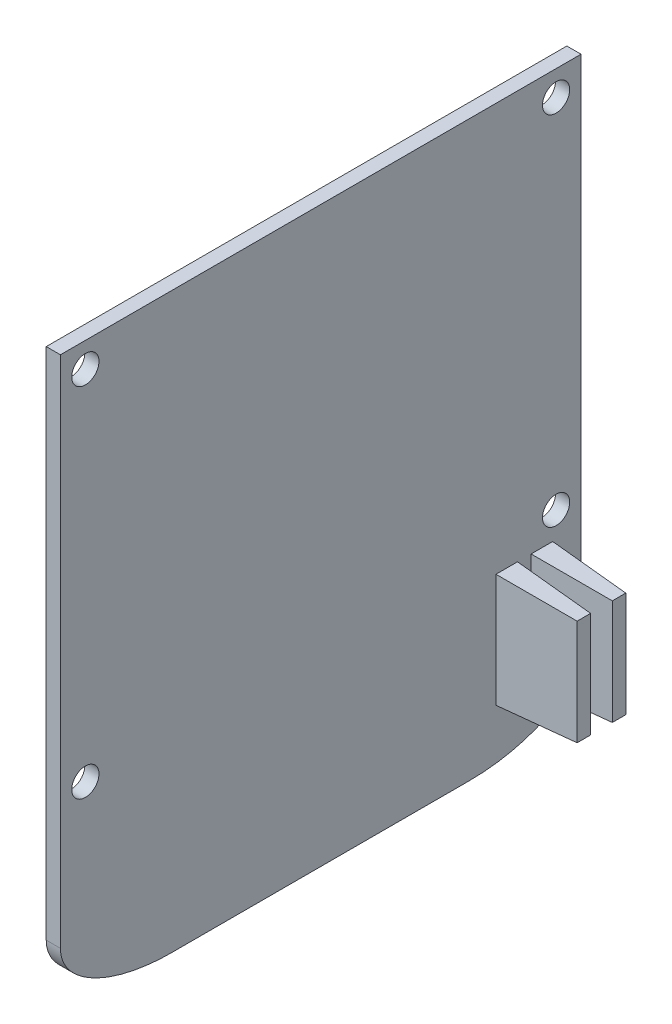
ISO-10303-21;
HEADER;
FILE_DESCRIPTION(('STEP AP214'),'2;1');
FILE_NAME('part.step','',(''),(''),'','','');
FILE_SCHEMA(('AUTOMOTIVE_DESIGN { 1 0 10303 214 1 1 1 1 }'));
ENDSEC;
DATA;
#1=APPLICATION_CONTEXT('core data for automotive mechanical design processes');
#2=APPLICATION_PROTOCOL_DEFINITION('international standard','automotive_design',2000,#1);
#3=PRODUCT_CONTEXT('',#1,'mechanical');
#4=PRODUCT('Part','Part','',(#3));
#5=PRODUCT_RELATED_PRODUCT_CATEGORY('part','',(#4));
#6=PRODUCT_DEFINITION_FORMATION('','',#4);
#7=PRODUCT_DEFINITION_CONTEXT('part definition',#1,'design');
#8=PRODUCT_DEFINITION('design','',#6,#7);
#9=PRODUCT_DEFINITION_SHAPE('','',#8);
#10=(LENGTH_UNIT() NAMED_UNIT(*) SI_UNIT(.MILLI.,.METRE.));
#11=(NAMED_UNIT(*) PLANE_ANGLE_UNIT() SI_UNIT($,.RADIAN.));
#12=(NAMED_UNIT(*) SI_UNIT($,.STERADIAN.) SOLID_ANGLE_UNIT());
#13=UNCERTAINTY_MEASURE_WITH_UNIT(LENGTH_MEASURE(1.E-05),#10,'distance_accuracy_value','');
#14=(GEOMETRIC_REPRESENTATION_CONTEXT(3) GLOBAL_UNCERTAINTY_ASSIGNED_CONTEXT((#13)) GLOBAL_UNIT_ASSIGNED_CONTEXT((#10,
#11,#12)) REPRESENTATION_CONTEXT('',''));
#15=CARTESIAN_POINT('',(0.,0.,0.));
#16=DIRECTION('',(0.,0.,1.));
#17=DIRECTION('',(1.,0.,0.));
#18=AXIS2_PLACEMENT_3D('',#15,#16,#17);
#19=CARTESIAN_POINT('',(1.5875,-51.3604696197896,-32.6236595759047));
#20=DIRECTION('',(1.,0.,0.));
#21=DIRECTION('',(0.,0.,-1.));
#22=AXIS2_PLACEMENT_3D('',#19,#20,#21);
#23=PLANE('',#22);
#24=DIRECTION('',(0.,-1.,0.));
#25=VECTOR('',#24,1.);
#26=CARTESIAN_POINT('',(1.5875,-52.1758096197896,-39.5947069141061));
#27=LINE('',#26,#25);
#28=CARTESIAN_POINT('',(1.5875,-39.4758096197896,-39.5947069141061));
#29=VERTEX_POINT('',#28);
#30=CARTESIAN_POINT('',(1.5875,-52.1758096197896,-39.5947069141061));
#31=VERTEX_POINT('',#30);
#32=EDGE_CURVE('E177',#29,#31,#27,.T.);
#33=ORIENTED_EDGE('',*,*,#32,.F.);
#34=DIRECTION('',(0.,0.,1.));
#35=VECTOR('',#34,1.);
#36=CARTESIAN_POINT('',(1.5875,-39.4758096197896,-42.0077069141061));
#37=LINE('',#36,#35);
#38=CARTESIAN_POINT('',(1.5875,-39.4758096197896,-42.0077069141061));
#39=VERTEX_POINT('',#38);
#40=EDGE_CURVE('E146',#39,#29,#37,.T.);
#41=ORIENTED_EDGE('',*,*,#40,.F.);
#42=DIRECTION('',(0.,1.,0.));
#43=VECTOR('',#42,1.);
#44=CARTESIAN_POINT('',(1.5875,-39.4758096197896,-42.0077069141061));
#45=LINE('',#44,#43);
#46=CARTESIAN_POINT('',(1.5875,-52.1758096197896,-42.0077069141061));
#47=VERTEX_POINT('',#46);
#48=EDGE_CURVE('E181',#47,#39,#45,.T.);
#49=ORIENTED_EDGE('',*,*,#48,.F.);
#50=DIRECTION('',(0.,0.,-1.));
#51=VECTOR('',#50,1.);
#52=CARTESIAN_POINT('',(1.5875,-52.1758096197896,-42.0077069141061));
#53=LINE('',#52,#51);
#54=EDGE_CURVE('E179',#31,#47,#53,.T.);
#55=ORIENTED_EDGE('',*,*,#54,.F.);
#56=EDGE_LOOP('',(#33,#41,#49,#55));
#57=FACE_BOUND('',#56,.T.);
#58=CARTESIAN_POINT('',(1.5875,-36.6056096197896,10.3035930858939));
#59=DIRECTION('',(1.,0.,0.));
#60=DIRECTION('',(0.,0.,-1.));
#61=AXIS2_PLACEMENT_3D('',#58,#59,#60);
#62=CIRCLE('',#61,1.524);
#63=CARTESIAN_POINT('',(1.5875,-36.6056096197896,8.77959308589388));
#64=VERTEX_POINT('',#63);
#65=EDGE_CURVE('E204',#64,#64,#62,.T.);
#66=ORIENTED_EDGE('',*,*,#65,.F.);
#67=EDGE_LOOP('',(#66));
#68=FACE_BOUND('',#67,.T.);
#69=CARTESIAN_POINT('',(1.5875,-36.6056096197896,-42.3887069141061));
#70=DIRECTION('',(1.,0.,0.));
#71=DIRECTION('',(0.,0.,-1.));
#72=AXIS2_PLACEMENT_3D('',#69,#70,#71);
#73=CIRCLE('',#72,1.524);
#74=CARTESIAN_POINT('',(1.5875,-36.6056096197896,-43.9127069141061));
#75=VERTEX_POINT('',#74);
#76=EDGE_CURVE('E210',#75,#75,#73,.T.);
#77=ORIENTED_EDGE('',*,*,#76,.F.);
#78=EDGE_LOOP('',(#77));
#79=FACE_BOUND('',#78,.T.);
#80=CARTESIAN_POINT('',(1.5875,3.38669038021042,10.3035930858939));
#81=DIRECTION('',(1.,0.,0.));
#82=DIRECTION('',(0.,0.,-1.));
#83=AXIS2_PLACEMENT_3D('',#80,#81,#82);
#84=CIRCLE('',#83,1.524);
#85=CARTESIAN_POINT('',(1.5875,3.38669038021042,8.77959308589388));
#86=VERTEX_POINT('',#85);
#87=EDGE_CURVE('E216',#86,#86,#84,.T.);
#88=ORIENTED_EDGE('',*,*,#87,.F.);
#89=EDGE_LOOP('',(#88));
#90=FACE_BOUND('',#89,.T.);
#91=CARTESIAN_POINT('',(1.5875,3.38669038021041,-42.3887069141061));
#92=DIRECTION('',(1.,0.,0.));
#93=DIRECTION('',(0.,0.,-1.));
#94=AXIS2_PLACEMENT_3D('',#91,#92,#93);
#95=CIRCLE('',#94,1.524);
#96=CARTESIAN_POINT('',(1.5875,3.38669038021041,-43.9127069141061));
#97=VERTEX_POINT('',#96);
#98=EDGE_CURVE('E222',#97,#97,#95,.T.);
#99=ORIENTED_EDGE('',*,*,#98,.F.);
#100=EDGE_LOOP('',(#99));
#101=FACE_BOUND('',#100,.T.);
#102=DIRECTION('',(0.,-1.,0.));
#103=VECTOR('',#102,1.);
#104=CARTESIAN_POINT('',(1.5875,-51.3604696197896,13.0975930858939));
#105=LINE('',#104,#103);
#106=CARTESIAN_POINT('',(1.5875,6.18069038021042,13.0975930858939));
#107=VERTEX_POINT('',#106);
#108=CARTESIAN_POINT('',(1.5875,-51.3604696197896,13.0975930858939));
#109=VERTEX_POINT('',#108);
#110=EDGE_CURVE('E226',#107,#109,#105,.T.);
#111=ORIENTED_EDGE('',*,*,#110,.T.);
#112=CARTESIAN_POINT('',(1.5875,-51.3604696197896,0.650340424095292));
#113=DIRECTION('',(1.,0.,0.));
#114=DIRECTION('',(0.,0.,-1.));
#115=AXIS2_PLACEMENT_3D('',#112,#113,#114);
#116=ELLIPSE('',#115,12.4472526617986,6.64464);
#117=CARTESIAN_POINT('',(1.5875,-58.0051096197896,0.650340424095291));
#118=VERTEX_POINT('',#117);
#119=EDGE_CURVE('E229',#109,#118,#116,.T.);
#120=ORIENTED_EDGE('',*,*,#119,.T.);
#121=DIRECTION('',(0.,0.,-1.));
#122=VECTOR('',#121,1.);
#123=CARTESIAN_POINT('',(1.5875,-58.0051096197896,-32.6236595759047));
#124=LINE('',#123,#122);
#125=CARTESIAN_POINT('',(1.5875,-58.0051096197896,-32.6236595759047));
#126=VERTEX_POINT('',#125);
#127=EDGE_CURVE('E233',#118,#126,#124,.T.);
#128=ORIENTED_EDGE('',*,*,#127,.T.);
#129=CARTESIAN_POINT('',(1.5875,-51.3604696197896,-32.6236595759047));
#130=DIRECTION('',(1.,0.,0.));
#131=DIRECTION('',(0.,0.,-1.));
#132=AXIS2_PLACEMENT_3D('',#129,#130,#131);
#133=ELLIPSE('',#132,12.5590473382014,6.64464);
#134=CARTESIAN_POINT('',(1.5875,-51.3604696197896,-45.1827069141061));
#135=VERTEX_POINT('',#134);
#136=EDGE_CURVE('E249',#126,#135,#133,.T.);
#137=ORIENTED_EDGE('',*,*,#136,.T.);
#138=DIRECTION('',(0.,1.,0.));
#139=VECTOR('',#138,1.);
#140=CARTESIAN_POINT('',(1.5875,-39.4224696197896,-45.1827069141061));
#141=LINE('',#140,#139);
#142=CARTESIAN_POINT('',(1.5875,6.18069038021042,-45.1827069141061));
#143=VERTEX_POINT('',#142);
#144=EDGE_CURVE('E252',#135,#143,#141,.T.);
#145=ORIENTED_EDGE('',*,*,#144,.T.);
#146=DIRECTION('',(0.,0.,1.));
#147=VECTOR('',#146,1.);
#148=CARTESIAN_POINT('',(1.5875,6.18069038021042,-45.1827069141061));
#149=LINE('',#148,#147);
#150=EDGE_CURVE('E254',#143,#107,#149,.T.);
#151=ORIENTED_EDGE('',*,*,#150,.T.);
#152=EDGE_LOOP('',(#111,#120,#128,#137,#145,#151));
#153=FACE_BOUND('',#152,.T.);
#154=DIRECTION('',(0.,1.,0.));
#155=VECTOR('',#154,1.);
#156=CARTESIAN_POINT('',(1.5875,-39.4758096197896,-38.0707069141061));
#157=LINE('',#156,#155);
#158=CARTESIAN_POINT('',(1.5875,-52.1758096197896,-38.0707069141061));
#159=VERTEX_POINT('',#158);
#160=CARTESIAN_POINT('',(1.5875,-39.4758096197896,-38.0707069141061));
#161=VERTEX_POINT('',#160);
#162=EDGE_CURVE('E140',#159,#161,#157,.T.);
#163=ORIENTED_EDGE('',*,*,#162,.F.);
#164=DIRECTION('',(0.,0.,-1.));
#165=VECTOR('',#164,1.);
#166=CARTESIAN_POINT('',(1.5875,-52.1758096197896,-38.0707069141061));
#167=LINE('',#166,#165);
#168=CARTESIAN_POINT('',(1.5875,-52.1758096197896,-35.6577069141061));
#169=VERTEX_POINT('',#168);
#170=EDGE_CURVE('E151',#169,#159,#167,.T.);
#171=ORIENTED_EDGE('',*,*,#170,.F.);
#172=DIRECTION('',(0.,-1.,0.));
#173=VECTOR('',#172,1.);
#174=CARTESIAN_POINT('',(1.5875,-52.1758096197896,-35.6577069141061));
#175=LINE('',#174,#173);
#176=CARTESIAN_POINT('',(1.5875,-39.4758096197896,-35.6577069141061));
#177=VERTEX_POINT('',#176);
#178=EDGE_CURVE('E161',#177,#169,#175,.T.);
#179=ORIENTED_EDGE('',*,*,#178,.F.);
#180=DIRECTION('',(0.,0.,1.));
#181=VECTOR('',#180,1.);
#182=CARTESIAN_POINT('',(1.5875,-39.4758096197896,-35.6577069141061));
#183=LINE('',#182,#181);
#184=EDGE_CURVE('E159',#161,#177,#183,.T.);
#185=ORIENTED_EDGE('',*,*,#184,.F.);
#186=EDGE_LOOP('',(#163,#171,#179,#185));
#187=FACE_BOUND('',#186,.T.);
#188=ADVANCED_FACE('F33',(#57,#68,#79,#90,#101,#153,#187),#23,.T.);
#189=CARTESIAN_POINT('',(1.5875,-51.3604696197896,13.0975930858939));
#190=DIRECTION('',(0.,0.,-1.));
#191=DIRECTION('',(-1.,0.,0.));
#192=AXIS2_PLACEMENT_3D('',#189,#190,#191);
#193=PLANE('',#192);
#194=DIRECTION('',(0.,-1.,0.));
#195=VECTOR('',#194,1.);
#196=CARTESIAN_POINT('',(0.,-51.3604696197896,13.0975930858939));
#197=LINE('',#196,#195);
#198=CARTESIAN_POINT('',(0.,6.18069038021042,13.0975930858939));
#199=VERTEX_POINT('',#198);
#200=CARTESIAN_POINT('',(0.,-51.3604696197896,13.0975930858939));
#201=VERTEX_POINT('',#200);
#202=EDGE_CURVE('E225',#199,#201,#197,.T.);
#203=ORIENTED_EDGE('',*,*,#202,.T.);
#204=DIRECTION('',(-1.,0.,0.));
#205=VECTOR('',#204,1.);
#206=CARTESIAN_POINT('',(1.5875,-51.3604696197896,13.0975930858939));
#207=LINE('',#206,#205);
#208=EDGE_CURVE('E11',#109,#201,#207,.T.);
#209=ORIENTED_EDGE('',*,*,#208,.F.);
#210=ORIENTED_EDGE('',*,*,#110,.F.);
#211=DIRECTION('',(-1.,0.,0.));
#212=VECTOR('',#211,1.);
#213=CARTESIAN_POINT('',(1.5875,6.18069038021042,13.0975930858939));
#214=LINE('',#213,#212);
#215=EDGE_CURVE('E256',#107,#199,#214,.T.);
#216=ORIENTED_EDGE('',*,*,#215,.T.);
#217=EDGE_LOOP('',(#203,#209,#210,#216));
#218=FACE_BOUND('',#217,.T.);
#219=ADVANCED_FACE('F35',(#218),#193,.F.);
#220=DIRECTION('',(-1.,0.,0.));
#221=VECTOR('',#220,1.);
#222=SURFACE_OF_LINEAR_EXTRUSION('',#116,#221);
#223=CARTESIAN_POINT('',(0.,-51.3604696197896,0.650340424095292));
#224=DIRECTION('',(1.,0.,0.));
#225=DIRECTION('',(0.,0.,-1.));
#226=AXIS2_PLACEMENT_3D('',#223,#224,#225);
#227=ELLIPSE('',#226,12.4472526617986,6.64464);
#228=CARTESIAN_POINT('',(0.,-58.0051096197896,0.650340424095291));
#229=VERTEX_POINT('',#228);
#230=EDGE_CURVE('E259',#201,#229,#227,.T.);
#231=ORIENTED_EDGE('',*,*,#230,.T.);
#232=DIRECTION('',(-1.,0.,0.));
#233=VECTOR('',#232,1.);
#234=CARTESIAN_POINT('',(1.5875,-58.0051096197896,0.650340424095291));
#235=LINE('',#234,#233);
#236=EDGE_CURVE('E41',#118,#229,#235,.T.);
#237=ORIENTED_EDGE('',*,*,#236,.F.);
#238=ORIENTED_EDGE('',*,*,#119,.F.);
#239=ORIENTED_EDGE('',*,*,#208,.T.);
#240=EDGE_LOOP('',(#231,#237,#238,#239));
#241=FACE_BOUND('',#240,.T.);
#242=ADVANCED_FACE('F235',(#241),#222,.F.);
#243=CARTESIAN_POINT('',(1.5875,-58.0051096197896,-32.6236595759047));
#244=DIRECTION('',(0.,1.,0.));
#245=DIRECTION('',(0.,0.,1.));
#246=AXIS2_PLACEMENT_3D('',#243,#244,#245);
#247=PLANE('',#246);
#248=DIRECTION('',(0.,0.,-1.));
#249=VECTOR('',#248,1.);
#250=CARTESIAN_POINT('',(0.,-58.0051096197896,-32.6236595759047));
#251=LINE('',#250,#249);
#252=CARTESIAN_POINT('',(0.,-58.0051096197896,-32.6236595759047));
#253=VERTEX_POINT('',#252);
#254=EDGE_CURVE('E261',#229,#253,#251,.T.);
#255=ORIENTED_EDGE('',*,*,#254,.T.);
#256=DIRECTION('',(-1.,0.,0.));
#257=VECTOR('',#256,1.);
#258=CARTESIAN_POINT('',(1.5875,-58.0051096197896,-32.6236595759047));
#259=LINE('',#258,#257);
#260=EDGE_CURVE('E277',#126,#253,#259,.T.);
#261=ORIENTED_EDGE('',*,*,#260,.F.);
#262=ORIENTED_EDGE('',*,*,#127,.F.);
#263=ORIENTED_EDGE('',*,*,#236,.T.);
#264=EDGE_LOOP('',(#255,#261,#262,#263));
#265=FACE_BOUND('',#264,.T.);
#266=ADVANCED_FACE('F238',(#265),#247,.F.);
#267=DIRECTION('',(-1.,0.,0.));
#268=VECTOR('',#267,1.);
#269=SURFACE_OF_LINEAR_EXTRUSION('',#133,#268);
#270=CARTESIAN_POINT('',(0.,-51.3604696197896,-32.6236595759047));
#271=DIRECTION('',(1.,0.,0.));
#272=DIRECTION('',(0.,0.,-1.));
#273=AXIS2_PLACEMENT_3D('',#270,#271,#272);
#274=ELLIPSE('',#273,12.5590473382014,6.64464);
#275=CARTESIAN_POINT('',(0.,-51.3604696197896,-45.1827069141061));
#276=VERTEX_POINT('',#275);
#277=EDGE_CURVE('E263',#253,#276,#274,.T.);
#278=ORIENTED_EDGE('',*,*,#277,.T.);
#279=DIRECTION('',(-1.,0.,0.));
#280=VECTOR('',#279,1.);
#281=CARTESIAN_POINT('',(1.5875,-51.3604696197896,-45.1827069141061));
#282=LINE('',#281,#280);
#283=EDGE_CURVE('E274',#135,#276,#282,.T.);
#284=ORIENTED_EDGE('',*,*,#283,.F.);
#285=ORIENTED_EDGE('',*,*,#136,.F.);
#286=ORIENTED_EDGE('',*,*,#260,.T.);
#287=EDGE_LOOP('',(#278,#284,#285,#286));
#288=FACE_BOUND('',#287,.T.);
#289=ADVANCED_FACE('F242',(#288),#269,.F.);
#290=CARTESIAN_POINT('',(1.5875,6.18069038021042,-45.1827069141061));
#291=DIRECTION('',(0.,0.,1.));
#292=DIRECTION('',(1.,0.,0.));
#293=AXIS2_PLACEMENT_3D('',#290,#291,#292);
#294=PLANE('',#293);
#295=DIRECTION('',(0.,1.,0.));
#296=VECTOR('',#295,1.);
#297=CARTESIAN_POINT('',(0.,6.18069038021042,-45.1827069141061));
#298=LINE('',#297,#296);
#299=CARTESIAN_POINT('',(0.,6.18069038021042,-45.1827069141061));
#300=VERTEX_POINT('',#299);
#301=EDGE_CURVE('E266',#276,#300,#298,.T.);
#302=ORIENTED_EDGE('',*,*,#301,.T.);
#303=DIRECTION('',(-1.,0.,0.));
#304=VECTOR('',#303,1.);
#305=CARTESIAN_POINT('',(1.5875,6.18069038021042,-45.1827069141061));
#306=LINE('',#305,#304);
#307=EDGE_CURVE('E271',#143,#300,#306,.T.);
#308=ORIENTED_EDGE('',*,*,#307,.F.);
#309=ORIENTED_EDGE('',*,*,#144,.F.);
#310=ORIENTED_EDGE('',*,*,#283,.T.);
#311=EDGE_LOOP('',(#302,#308,#309,#310));
#312=FACE_BOUND('',#311,.T.);
#313=ADVANCED_FACE('F246',(#312),#294,.F.);
#314=CARTESIAN_POINT('',(1.5875,6.18069038021042,-45.1827069141061));
#315=DIRECTION('',(0.,-1.,0.));
#316=DIRECTION('',(0.,0.,-1.));
#317=AXIS2_PLACEMENT_3D('',#314,#315,#316);
#318=PLANE('',#317);
#319=DIRECTION('',(0.,0.,1.));
#320=VECTOR('',#319,1.);
#321=CARTESIAN_POINT('',(0.,6.18069038021042,-45.1827069141061));
#322=LINE('',#321,#320);
#323=EDGE_CURVE('E230',#300,#199,#322,.T.);
#324=ORIENTED_EDGE('',*,*,#323,.T.);
#325=ORIENTED_EDGE('',*,*,#215,.F.);
#326=ORIENTED_EDGE('',*,*,#150,.F.);
#327=ORIENTED_EDGE('',*,*,#307,.T.);
#328=EDGE_LOOP('',(#324,#325,#326,#327));
#329=FACE_BOUND('',#328,.T.);
#330=ADVANCED_FACE('F301',(#329),#318,.F.);
#331=CARTESIAN_POINT('',(0.,-51.3604696197896,-32.6236595759047));
#332=DIRECTION('',(1.,0.,0.));
#333=DIRECTION('',(0.,0.,-1.));
#334=AXIS2_PLACEMENT_3D('',#331,#332,#333);
#335=PLANE('',#334);
#336=CARTESIAN_POINT('',(0.,-36.6056096197896,10.3035930858939));
#337=DIRECTION('',(-1.,0.,0.));
#338=DIRECTION('',(0.,0.,1.));
#339=AXIS2_PLACEMENT_3D('',#336,#337,#338);
#340=CIRCLE('',#339,1.524);
#341=CARTESIAN_POINT('',(0.,-36.6056096197896,11.8275930858939));
#342=VERTEX_POINT('',#341);
#343=EDGE_CURVE('E186',#342,#342,#340,.T.);
#344=ORIENTED_EDGE('',*,*,#343,.F.);
#345=EDGE_LOOP('',(#344));
#346=FACE_BOUND('',#345,.T.);
#347=CARTESIAN_POINT('',(0.,-36.6056096197896,-42.3887069141061));
#348=DIRECTION('',(-1.,0.,0.));
#349=DIRECTION('',(0.,0.,1.));
#350=AXIS2_PLACEMENT_3D('',#347,#348,#349);
#351=CIRCLE('',#350,1.524);
#352=CARTESIAN_POINT('',(0.,-36.6056096197896,-40.8647069141061));
#353=VERTEX_POINT('',#352);
#354=EDGE_CURVE('E207',#353,#353,#351,.T.);
#355=ORIENTED_EDGE('',*,*,#354,.F.);
#356=EDGE_LOOP('',(#355));
#357=FACE_BOUND('',#356,.T.);
#358=CARTESIAN_POINT('',(0.,3.38669038021042,10.3035930858939));
#359=DIRECTION('',(-1.,0.,0.));
#360=DIRECTION('',(0.,0.,1.));
#361=AXIS2_PLACEMENT_3D('',#358,#359,#360);
#362=CIRCLE('',#361,1.524);
#363=CARTESIAN_POINT('',(0.,3.38669038021042,11.8275930858939));
#364=VERTEX_POINT('',#363);
#365=EDGE_CURVE('E213',#364,#364,#362,.T.);
#366=ORIENTED_EDGE('',*,*,#365,.F.);
#367=EDGE_LOOP('',(#366));
#368=FACE_BOUND('',#367,.T.);
#369=CARTESIAN_POINT('',(0.,3.38669038021041,-42.3887069141061));
#370=DIRECTION('',(-1.,0.,0.));
#371=DIRECTION('',(0.,0.,1.));
#372=AXIS2_PLACEMENT_3D('',#369,#370,#371);
#373=CIRCLE('',#372,1.524);
#374=CARTESIAN_POINT('',(0.,3.38669038021041,-40.8647069141061));
#375=VERTEX_POINT('',#374);
#376=EDGE_CURVE('E219',#375,#375,#373,.T.);
#377=ORIENTED_EDGE('',*,*,#376,.F.);
#378=EDGE_LOOP('',(#377));
#379=FACE_BOUND('',#378,.T.);
#380=ORIENTED_EDGE('',*,*,#202,.F.);
#381=ORIENTED_EDGE('',*,*,#323,.F.);
#382=ORIENTED_EDGE('',*,*,#301,.F.);
#383=ORIENTED_EDGE('',*,*,#277,.F.);
#384=ORIENTED_EDGE('',*,*,#254,.F.);
#385=ORIENTED_EDGE('',*,*,#230,.F.);
#386=EDGE_LOOP('',(#380,#381,#382,#383,#384,#385));
#387=FACE_BOUND('',#386,.T.);
#388=ADVANCED_FACE('F287',(#346,#357,#368,#379,#387),#335,.F.);
#389=CARTESIAN_POINT('',(2.54,3.38669038021041,-42.3887069141061));
#390=DIRECTION('',(-1.,0.,0.));
#391=DIRECTION('',(0.,0.,1.));
#392=AXIS2_PLACEMENT_3D('',#389,#390,#391);
#393=CYLINDRICAL_SURFACE('',#392,1.524);
#394=ORIENTED_EDGE('',*,*,#98,.T.);
#395=EDGE_LOOP('',(#394));
#396=FACE_BOUND('',#395,.T.);
#397=ORIENTED_EDGE('',*,*,#376,.T.);
#398=EDGE_LOOP('',(#397));
#399=FACE_BOUND('',#398,.T.);
#400=ADVANCED_FACE('F307',(#396,#399),#393,.F.);
#401=CARTESIAN_POINT('',(2.54,3.38669038021042,10.3035930858939));
#402=DIRECTION('',(-1.,0.,0.));
#403=DIRECTION('',(0.,0.,1.));
#404=AXIS2_PLACEMENT_3D('',#401,#402,#403);
#405=CYLINDRICAL_SURFACE('',#404,1.524);
#406=ORIENTED_EDGE('',*,*,#87,.T.);
#407=EDGE_LOOP('',(#406));
#408=FACE_BOUND('',#407,.T.);
#409=ORIENTED_EDGE('',*,*,#365,.T.);
#410=EDGE_LOOP('',(#409));
#411=FACE_BOUND('',#410,.T.);
#412=ADVANCED_FACE('F321',(#408,#411),#405,.F.);
#413=CARTESIAN_POINT('',(2.54,-36.6056096197896,-42.3887069141061));
#414=DIRECTION('',(-1.,0.,0.));
#415=DIRECTION('',(0.,0.,1.));
#416=AXIS2_PLACEMENT_3D('',#413,#414,#415);
#417=CYLINDRICAL_SURFACE('',#416,1.524);
#418=ORIENTED_EDGE('',*,*,#76,.T.);
#419=EDGE_LOOP('',(#418));
#420=FACE_BOUND('',#419,.T.);
#421=ORIENTED_EDGE('',*,*,#354,.T.);
#422=EDGE_LOOP('',(#421));
#423=FACE_BOUND('',#422,.T.);
#424=ADVANCED_FACE('F325',(#420,#423),#417,.F.);
#425=CARTESIAN_POINT('',(2.54,-36.6056096197896,10.3035930858939));
#426=DIRECTION('',(-1.,0.,0.));
#427=DIRECTION('',(0.,0.,1.));
#428=AXIS2_PLACEMENT_3D('',#425,#426,#427);
#429=CYLINDRICAL_SURFACE('',#428,1.524);
#430=ORIENTED_EDGE('',*,*,#65,.T.);
#431=EDGE_LOOP('',(#430));
#432=FACE_BOUND('',#431,.T.);
#433=ORIENTED_EDGE('',*,*,#343,.T.);
#434=EDGE_LOOP('',(#433));
#435=FACE_BOUND('',#434,.T.);
#436=ADVANCED_FACE('F329',(#432,#435),#429,.F.);
#437=CARTESIAN_POINT('',(1.5875,-39.4758096197896,-42.0077069141061));
#438=DIRECTION('',(0.0523359562429439,0.998629534754574,0.));
#439=DIRECTION('',(-0.998629534754574,0.052335956242944,0.));
#440=AXIS2_PLACEMENT_3D('',#437,#438,#439);
#441=PLANE('',#440);
#442=ORIENTED_EDGE('',*,*,#40,.T.);
#443=DIRECTION('',(-0.997264688634237,0.052264427688714,0.052264427688714));
#444=VECTOR('',#443,1.);
#445=CARTESIAN_POINT('',(2.24944264621153,-39.5105005638903,-39.6293978582068));
#446=LINE('',#445,#444);
#447=CARTESIAN_POINT('',(10.2235,-39.9284032016779,-40.0473004959945));
#448=VERTEX_POINT('',#447);
#449=EDGE_CURVE('E184',#448,#29,#446,.T.);
#450=ORIENTED_EDGE('',*,*,#449,.F.);
#451=DIRECTION('',(0.,0.,-1.));
#452=VECTOR('',#451,1.);
#453=CARTESIAN_POINT('',(10.2235,-39.9284032016779,0.));
#454=LINE('',#453,#452);
#455=CARTESIAN_POINT('',(10.2235,-39.9284032016779,-41.5551133322178));
#456=VERTEX_POINT('',#455);
#457=EDGE_CURVE('E183',#456,#448,#454,.F.);
#458=ORIENTED_EDGE('',*,*,#457,.F.);
#459=DIRECTION('',(-0.997264688634237,0.052264427688714,-0.052264427688714));
#460=VECTOR('',#459,1.);
#461=CARTESIAN_POINT('',(1.5875,-39.4758096197896,-42.0077069141061));
#462=LINE('',#461,#460);
#463=EDGE_CURVE('E188',#456,#39,#462,.T.);
#464=ORIENTED_EDGE('',*,*,#463,.T.);
#465=EDGE_LOOP('',(#442,#450,#458,#464));
#466=FACE_BOUND('',#465,.T.);
#467=ADVANCED_FACE('F333',(#466),#441,.T.);
#468=CARTESIAN_POINT('',(1.5875,-52.1758096197896,-39.5947069141061));
#469=DIRECTION('',(0.0523359562429439,0.,0.998629534754574));
#470=DIRECTION('',(0.998629534754574,0.,-0.052335956242944));
#471=AXIS2_PLACEMENT_3D('',#468,#469,#470);
#472=PLANE('',#471);
#473=ORIENTED_EDGE('',*,*,#32,.T.);
#474=DIRECTION('',(-0.997264688634237,-0.052264427688714,0.052264427688714));
#475=VECTOR('',#474,1.);
#476=CARTESIAN_POINT('',(1.71326910278019,-52.1692183404105,-39.6012981934853));
#477=LINE('',#476,#475);
#478=CARTESIAN_POINT('',(10.2235,-51.7232160379012,-40.0473004959945));
#479=VERTEX_POINT('',#478);
#480=EDGE_CURVE('E187',#479,#31,#477,.T.);
#481=ORIENTED_EDGE('',*,*,#480,.F.);
#482=DIRECTION('',(0.,1.,0.));
#483=VECTOR('',#482,1.);
#484=CARTESIAN_POINT('',(10.2235,0.,-40.0473004959945));
#485=LINE('',#484,#483);
#486=EDGE_CURVE('E197',#448,#479,#485,.F.);
#487=ORIENTED_EDGE('',*,*,#486,.F.);
#488=ORIENTED_EDGE('',*,*,#449,.T.);
#489=EDGE_LOOP('',(#473,#481,#487,#488));
#490=FACE_BOUND('',#489,.T.);
#491=ADVANCED_FACE('F335',(#490),#472,.T.);
#492=CARTESIAN_POINT('',(1.5875,-52.1758096197896,-42.0077069141061));
#493=DIRECTION('',(0.0523359562429439,-0.998629534754574,0.));
#494=DIRECTION('',(0.998629534754574,0.052335956242944,0.));
#495=AXIS2_PLACEMENT_3D('',#492,#493,#494);
#496=PLANE('',#495);
#497=ORIENTED_EDGE('',*,*,#54,.T.);
#498=DIRECTION('',(-0.997264688634237,-0.052264427688714,-0.052264427688714));
#499=VECTOR('',#498,1.);
#500=CARTESIAN_POINT('',(2.24944264621153,-52.1411186756889,-41.9730159700055));
#501=LINE('',#500,#499);
#502=CARTESIAN_POINT('',(10.2235,-51.7232160379012,-41.5551133322178));
#503=VERTEX_POINT('',#502);
#504=EDGE_CURVE('E56',#503,#47,#501,.T.);
#505=ORIENTED_EDGE('',*,*,#504,.F.);
#506=DIRECTION('',(0.,0.,1.));
#507=VECTOR('',#506,1.);
#508=CARTESIAN_POINT('',(10.2235,-51.7232160379012,0.));
#509=LINE('',#508,#507);
#510=EDGE_CURVE('E199',#479,#503,#509,.F.);
#511=ORIENTED_EDGE('',*,*,#510,.F.);
#512=ORIENTED_EDGE('',*,*,#480,.T.);
#513=EDGE_LOOP('',(#497,#505,#511,#512));
#514=FACE_BOUND('',#513,.T.);
#515=ADVANCED_FACE('F338',(#514),#496,.T.);
#516=CARTESIAN_POINT('',(1.5875,-39.4758096197896,-42.0077069141061));
#517=DIRECTION('',(0.0523359562429439,0.,-0.998629534754574));
#518=DIRECTION('',(-0.998629534754574,0.,-0.052335956242944));
#519=AXIS2_PLACEMENT_3D('',#516,#517,#518);
#520=PLANE('',#519);
#521=ORIENTED_EDGE('',*,*,#48,.T.);
#522=ORIENTED_EDGE('',*,*,#463,.F.);
#523=DIRECTION('',(0.,-1.,0.));
#524=VECTOR('',#523,1.);
#525=CARTESIAN_POINT('',(10.2235,0.,-41.5551133322178));
#526=LINE('',#525,#524);
#527=EDGE_CURVE('E191',#503,#456,#526,.F.);
#528=ORIENTED_EDGE('',*,*,#527,.F.);
#529=ORIENTED_EDGE('',*,*,#504,.T.);
#530=EDGE_LOOP('',(#521,#522,#528,#529));
#531=FACE_BOUND('',#530,.T.);
#532=ADVANCED_FACE('F342',(#531),#520,.T.);
#533=CARTESIAN_POINT('',(10.2235,0.,0.));
#534=DIRECTION('',(-1.,0.,0.));
#535=DIRECTION('',(0.,0.,1.));
#536=AXIS2_PLACEMENT_3D('',#533,#534,#535);
#537=PLANE('',#536);
#538=ORIENTED_EDGE('',*,*,#457,.T.);
#539=ORIENTED_EDGE('',*,*,#486,.T.);
#540=ORIENTED_EDGE('',*,*,#510,.T.);
#541=ORIENTED_EDGE('',*,*,#527,.T.);
#542=EDGE_LOOP('',(#538,#539,#540,#541));
#543=FACE_BOUND('',#542,.T.);
#544=ADVANCED_FACE('F346',(#543),#537,.F.);
#545=CARTESIAN_POINT('',(1.5875,-52.1758096197896,-38.0707069141061));
#546=DIRECTION('',(0.0523359562429439,-0.998629534754574,0.));
#547=DIRECTION('',(0.998629534754574,0.052335956242944,0.));
#548=AXIS2_PLACEMENT_3D('',#545,#546,#547);
#549=PLANE('',#548);
#550=ORIENTED_EDGE('',*,*,#170,.T.);
#551=DIRECTION('',(-0.997264688634237,-0.052264427688714,-0.052264427688714));
#552=VECTOR('',#551,1.);
#553=CARTESIAN_POINT('',(2.24944264621153,-52.1411186756889,-38.0360159700055));
#554=LINE('',#553,#552);
#555=CARTESIAN_POINT('',(10.2235,-51.7232160379012,-37.6181133322178));
#556=VERTEX_POINT('',#555);
#557=EDGE_CURVE('E135',#556,#159,#554,.T.);
#558=ORIENTED_EDGE('',*,*,#557,.F.);
#559=DIRECTION('',(0.,0.,1.));
#560=VECTOR('',#559,1.);
#561=CARTESIAN_POINT('',(10.2235,-51.7232160379012,0.));
#562=LINE('',#561,#560);
#563=CARTESIAN_POINT('',(10.2235,-51.7232160379012,-36.1103004959945));
#564=VERTEX_POINT('',#563);
#565=EDGE_CURVE('E164',#564,#556,#562,.F.);
#566=ORIENTED_EDGE('',*,*,#565,.F.);
#567=DIRECTION('',(-0.997264688634237,-0.052264427688714,0.052264427688714));
#568=VECTOR('',#567,1.);
#569=CARTESIAN_POINT('',(1.71326910278019,-52.1692183404105,-35.6642981934853));
#570=LINE('',#569,#568);
#571=EDGE_CURVE('E154',#564,#169,#570,.T.);
#572=ORIENTED_EDGE('',*,*,#571,.T.);
#573=EDGE_LOOP('',(#550,#558,#566,#572));
#574=FACE_BOUND('',#573,.T.);
#575=ADVANCED_FACE('F152',(#574),#549,.T.);
#576=CARTESIAN_POINT('',(1.5875,-39.4758096197896,-38.0707069141061));
#577=DIRECTION('',(0.0523359562429439,0.,-0.998629534754574));
#578=DIRECTION('',(-0.998629534754574,0.,-0.052335956242944));
#579=AXIS2_PLACEMENT_3D('',#576,#577,#578);
#580=PLANE('',#579);
#581=ORIENTED_EDGE('',*,*,#162,.T.);
#582=DIRECTION('',(-0.997264688634237,0.052264427688714,-0.052264427688714));
#583=VECTOR('',#582,1.);
#584=CARTESIAN_POINT('',(1.71326910278019,-39.4824008991687,-38.064115634727));
#585=LINE('',#584,#583);
#586=CARTESIAN_POINT('',(10.2235,-39.9284032016779,-37.6181133322178));
#587=VERTEX_POINT('',#586);
#588=EDGE_CURVE('E147',#587,#161,#585,.T.);
#589=ORIENTED_EDGE('',*,*,#588,.F.);
#590=DIRECTION('',(0.,-1.,0.));
#591=VECTOR('',#590,1.);
#592=CARTESIAN_POINT('',(10.2235,0.,-37.6181133322178));
#593=LINE('',#592,#591);
#594=EDGE_CURVE('E142',#556,#587,#593,.F.);
#595=ORIENTED_EDGE('',*,*,#594,.F.);
#596=ORIENTED_EDGE('',*,*,#557,.T.);
#597=EDGE_LOOP('',(#581,#589,#595,#596));
#598=FACE_BOUND('',#597,.T.);
#599=ADVANCED_FACE('F137',(#598),#580,.T.);
#600=CARTESIAN_POINT('',(1.5875,-39.4758096197896,-35.6577069141061));
#601=DIRECTION('',(0.0523359562429439,0.998629534754574,0.));
#602=DIRECTION('',(-0.998629534754574,0.052335956242944,0.));
#603=AXIS2_PLACEMENT_3D('',#600,#601,#602);
#604=PLANE('',#603);
#605=ORIENTED_EDGE('',*,*,#184,.T.);
#606=DIRECTION('',(-0.997264688634237,0.052264427688714,0.052264427688714));
#607=VECTOR('',#606,1.);
#608=CARTESIAN_POINT('',(2.24944264621153,-39.5105005638903,-35.6923978582068));
#609=LINE('',#608,#607);
#610=CARTESIAN_POINT('',(10.2235,-39.9284032016779,-36.1103004959945));
#611=VERTEX_POINT('',#610);
#612=EDGE_CURVE('E48',#611,#177,#609,.T.);
#613=ORIENTED_EDGE('',*,*,#612,.F.);
#614=DIRECTION('',(0.,0.,-1.));
#615=VECTOR('',#614,1.);
#616=CARTESIAN_POINT('',(10.2235,-39.9284032016779,0.));
#617=LINE('',#616,#615);
#618=EDGE_CURVE('E172',#587,#611,#617,.F.);
#619=ORIENTED_EDGE('',*,*,#618,.F.);
#620=ORIENTED_EDGE('',*,*,#588,.T.);
#621=EDGE_LOOP('',(#605,#613,#619,#620));
#622=FACE_BOUND('',#621,.T.);
#623=ADVANCED_FACE('F355',(#622),#604,.T.);
#624=CARTESIAN_POINT('',(1.5875,-52.1758096197896,-35.6577069141061));
#625=DIRECTION('',(0.0523359562429439,0.,0.998629534754574));
#626=DIRECTION('',(0.998629534754574,0.,-0.052335956242944));
#627=AXIS2_PLACEMENT_3D('',#624,#625,#626);
#628=PLANE('',#627);
#629=ORIENTED_EDGE('',*,*,#178,.T.);
#630=ORIENTED_EDGE('',*,*,#571,.F.);
#631=DIRECTION('',(0.,1.,0.));
#632=VECTOR('',#631,1.);
#633=CARTESIAN_POINT('',(10.2235,0.,-36.1103004959945));
#634=LINE('',#633,#632);
#635=EDGE_CURVE('E167',#611,#564,#634,.F.);
#636=ORIENTED_EDGE('',*,*,#635,.F.);
#637=ORIENTED_EDGE('',*,*,#612,.T.);
#638=EDGE_LOOP('',(#629,#630,#636,#637));
#639=FACE_BOUND('',#638,.T.);
#640=ADVANCED_FACE('F358',(#639),#628,.T.);
#641=CARTESIAN_POINT('',(10.2235,0.,0.));
#642=DIRECTION('',(-1.,0.,0.));
#643=DIRECTION('',(0.,0.,1.));
#644=AXIS2_PLACEMENT_3D('',#641,#642,#643);
#645=PLANE('',#644);
#646=ORIENTED_EDGE('',*,*,#565,.T.);
#647=ORIENTED_EDGE('',*,*,#594,.T.);
#648=ORIENTED_EDGE('',*,*,#618,.T.);
#649=ORIENTED_EDGE('',*,*,#635,.T.);
#650=EDGE_LOOP('',(#646,#647,#648,#649));
#651=FACE_BOUND('',#650,.T.);
#652=ADVANCED_FACE('F362',(#651),#645,.F.);
#653=CLOSED_SHELL('',(#188,#219,#242,#266,#289,#313,#330,#388,#400,#412,#424,#436,#467,#491,
#515,#532,#544,#575,#599,#623,#640,#652));
#654=MANIFOLD_SOLID_BREP('B2',#653);
#655=ADVANCED_BREP_SHAPE_REPRESENTATION('',(#18,#654),#14);
#656=SHAPE_DEFINITION_REPRESENTATION(#9,#655);
ENDSEC;
END-ISO-10303-21;
